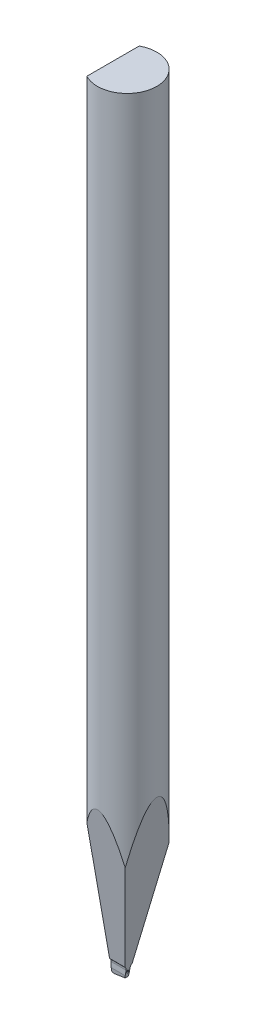
ISO-10303-21;
HEADER;
FILE_DESCRIPTION(('STEP AP214'),'2;1');
FILE_NAME('part.step','',(''),(''),'','','');
FILE_SCHEMA(('AUTOMOTIVE_DESIGN { 1 0 10303 214 1 1 1 1 }'));
ENDSEC;
DATA;
#1=APPLICATION_CONTEXT('core data for automotive mechanical design processes');
#2=APPLICATION_PROTOCOL_DEFINITION('international standard','automotive_design',2000,#1);
#3=PRODUCT_CONTEXT('',#1,'mechanical');
#4=PRODUCT('Part','Part','',(#3));
#5=PRODUCT_RELATED_PRODUCT_CATEGORY('part','',(#4));
#6=PRODUCT_DEFINITION_FORMATION('','',#4);
#7=PRODUCT_DEFINITION_CONTEXT('part definition',#1,'design');
#8=PRODUCT_DEFINITION('design','',#6,#7);
#9=PRODUCT_DEFINITION_SHAPE('','',#8);
#10=(LENGTH_UNIT() NAMED_UNIT(*) SI_UNIT(.MILLI.,.METRE.));
#11=(NAMED_UNIT(*) PLANE_ANGLE_UNIT() SI_UNIT($,.RADIAN.));
#12=(NAMED_UNIT(*) SI_UNIT($,.STERADIAN.) SOLID_ANGLE_UNIT());
#13=UNCERTAINTY_MEASURE_WITH_UNIT(LENGTH_MEASURE(1.E-05),#10,'distance_accuracy_value','');
#14=(GEOMETRIC_REPRESENTATION_CONTEXT(3) GLOBAL_UNCERTAINTY_ASSIGNED_CONTEXT((#13)) GLOBAL_UNIT_ASSIGNED_CONTEXT((#10,
#11,#12)) REPRESENTATION_CONTEXT('',''));
#15=CARTESIAN_POINT('',(0.,0.,0.));
#16=DIRECTION('',(0.,0.,1.));
#17=DIRECTION('',(1.,0.,0.));
#18=AXIS2_PLACEMENT_3D('',#15,#16,#17);
#19=CARTESIAN_POINT('',(26.8738719491216,0.,0.03048));
#20=DIRECTION('',(0.,-0.173648177666931,0.984807753012208));
#21=DIRECTION('',(0.,-0.984807753012208,-0.173648177666931));
#22=AXIS2_PLACEMENT_3D('',#19,#20,#21);
#23=PLANE('',#22);
#24=CARTESIAN_POINT('',(-0.3480816,0.02794,0.0354065758409912));
#25=DIRECTION('',(0.,-0.173648177666931,0.984807753012208));
#26=DIRECTION('',(0.,-0.984807753012208,-0.173648177666931));
#27=AXIS2_PLACEMENT_3D('',#24,#25,#26);
#28=ELLIPSE('',#27,0.0283710195360877,0.02794);
#29=CARTESIAN_POINT('',(-0.348081599999999,0.,0.0305196359577052));
#30=VERTEX_POINT('',#29);
#31=CARTESIAN_POINT('',(-0.37592,0.0255594358987768,0.0349868181606424));
#32=VERTEX_POINT('',#31);
#33=EDGE_CURVE('E256',#30,#32,#28,.F.);
#34=ORIENTED_EDGE('',*,*,#33,.F.);
#35=CARTESIAN_POINT('',(-0.299720000000003,0.,0.0305592719154106));
#36=DIRECTION('',(-1.,0.,0.));
#37=VECTOR('',#36,1.);
#38=LINE('',#35,#37);
#39=CARTESIAN_POINT('',(-0.299720000000004,0.,0.0305196359577053));
#40=VERTEX_POINT('',#39);
#41=EDGE_CURVE('E283',#40,#30,#38,.T.);
#42=ORIENTED_EDGE('',*,*,#41,.F.);
#43=DIRECTION('',(-0.984346441568213,-0.173566836012845,-0.0306045161452665));
#44=VECTOR('',#43,1.);
#45=CARTESIAN_POINT('',(26.0298035813508,4.64260539659195,0.849096592201888));
#46=LINE('',#45,#44);
#47=CARTESIAN_POINT('',(-0.0113543651851163,0.0508466417269895,0.0394456348148853));
#48=VERTEX_POINT('',#47);
#49=EDGE_CURVE('E356',#48,#40,#46,.T.);
#50=ORIENTED_EDGE('',*,*,#49,.F.);
#51=DIRECTION('',(-0.171087869746036,-0.970287525247814,-0.171087869746036));
#52=VECTOR('',#51,1.);
#53=CARTESIAN_POINT('',(0.766901483986011,4.46455489014234,0.817701483986016));
#54=LINE('',#53,#52);
#55=CARTESIAN_POINT('',(0.,0.115240446574631,0.0508));
#56=VERTEX_POINT('',#55);
#57=EDGE_CURVE('E341',#56,#48,#54,.T.);
#58=ORIENTED_EDGE('',*,*,#57,.F.);
#59=DIRECTION('',(-1.,0.,0.));
#60=VECTOR('',#59,1.);
#61=CARTESIAN_POINT('',(26.8738719491216,0.115240446574631,0.0508));
#62=LINE('',#61,#60);
#63=CARTESIAN_POINT('',(-0.375919999999998,0.115240446574631,0.0508));
#64=VERTEX_POINT('',#63);
#65=EDGE_CURVE('E539',#56,#64,#62,.T.);
#66=ORIENTED_EDGE('',*,*,#65,.T.);
#67=DIRECTION('',(0.,0.984807753012208,0.173648177666931));
#68=VECTOR('',#67,1.);
#69=CARTESIAN_POINT('',(-0.37592,20.2545871772642,3.60191020246341));
#70=LINE('',#69,#68);
#71=EDGE_CURVE('E54',#32,#64,#70,.T.);
#72=ORIENTED_EDGE('',*,*,#71,.F.);
#73=EDGE_LOOP('',(#34,#42,#50,#58,#66,#72));
#74=FACE_BOUND('',#73,.T.);
#75=ADVANCED_FACE('F46',(#74),#23,.T.);
#76=CARTESIAN_POINT('',(26.8738719491216,0.,-0.03048));
#77=DIRECTION('',(0.,-0.173648177666931,-0.984807753012208));
#78=DIRECTION('',(0.,0.984807753012208,-0.173648177666931));
#79=AXIS2_PLACEMENT_3D('',#76,#77,#78);
#80=PLANE('',#79);
#81=CARTESIAN_POINT('',(-0.3480816,0.02794,-0.0354065758409912));
#82=DIRECTION('',(0.,-0.173648177666931,-0.984807753012208));
#83=DIRECTION('',(0.,0.984807753012208,-0.173648177666931));
#84=AXIS2_PLACEMENT_3D('',#81,#82,#83);
#85=ELLIPSE('',#84,0.0283710195360877,0.02794);
#86=CARTESIAN_POINT('',(-0.37592,0.0255594358987768,-0.0349868181606433));
#87=VERTEX_POINT('',#86);
#88=CARTESIAN_POINT('',(-0.348081601133757,0.,-0.0305196359577052));
#89=VERTEX_POINT('',#88);
#90=EDGE_CURVE('E216',#87,#89,#85,.F.);
#91=ORIENTED_EDGE('',*,*,#90,.F.);
#92=DIRECTION('',(0.,-0.984807753012208,0.173648177666931));
#93=VECTOR('',#92,1.);
#94=CARTESIAN_POINT('',(-0.37592,20.5290514950398,-3.65030566692899));
#95=LINE('',#94,#93);
#96=CARTESIAN_POINT('',(-0.375919999999998,0.115240446574631,-0.0508));
#97=VERTEX_POINT('',#96);
#98=EDGE_CURVE('E75',#97,#87,#95,.T.);
#99=ORIENTED_EDGE('',*,*,#98,.F.);
#100=DIRECTION('',(1.,0.,0.));
#101=VECTOR('',#100,1.);
#102=CARTESIAN_POINT('',(26.8738719491216,0.115240446574631,-0.0508));
#103=LINE('',#102,#101);
#104=CARTESIAN_POINT('',(0.,0.115240446574631,-0.0508));
#105=VERTEX_POINT('',#104);
#106=EDGE_CURVE('E398',#97,#105,#103,.T.);
#107=ORIENTED_EDGE('',*,*,#106,.T.);
#108=DIRECTION('',(0.171087869746036,0.970287525247814,-0.171087869746036));
#109=VECTOR('',#108,1.);
#110=CARTESIAN_POINT('',(0.766901483986011,4.46455489014234,-0.817701483986016));
#111=LINE('',#110,#109);
#112=CARTESIAN_POINT('',(-0.0113543651851163,0.0508466417269895,-0.0394456348148853));
#113=VERTEX_POINT('',#112);
#114=EDGE_CURVE('E353',#113,#105,#111,.T.);
#115=ORIENTED_EDGE('',*,*,#114,.F.);
#116=DIRECTION('',(0.984346441568213,0.173566836012845,-0.0306045161452665));
#117=VECTOR('',#116,1.);
#118=CARTESIAN_POINT('',(26.0298035813508,4.64260539659195,-0.849096592201888));
#119=LINE('',#118,#117);
#120=CARTESIAN_POINT('',(-0.299720000000004,0.,-0.0305196359577053));
#121=VERTEX_POINT('',#120);
#122=EDGE_CURVE('E439',#121,#113,#119,.T.);
#123=ORIENTED_EDGE('',*,*,#122,.F.);
#124=CARTESIAN_POINT('',(-0.299720000000007,0.,-0.0304799999999999));
#125=DIRECTION('',(-1.,0.,0.));
#126=VECTOR('',#125,1.);
#127=LINE('',#124,#126);
#128=EDGE_CURVE('E278',#121,#89,#127,.T.);
#129=ORIENTED_EDGE('',*,*,#128,.T.);
#130=EDGE_LOOP('',(#91,#99,#107,#115,#123,#129));
#131=FACE_BOUND('',#130,.T.);
#132=ADVANCED_FACE('F422',(#131),#80,.T.);
#133=CARTESIAN_POINT('',(-0.29972,0.,26.5186797019495));
#134=DIRECTION('',(-0.173648177666931,0.984807753012208,0.));
#135=DIRECTION('',(-0.984807753012208,-0.173648177666931,0.));
#136=AXIS2_PLACEMENT_3D('',#133,#134,#135);
#137=PLANE('',#136);
#138=ORIENTED_EDGE('',*,*,#49,.T.);
#139=CARTESIAN_POINT('',(-0.983960151536872,-0.12065,0.));
#140=DIRECTION('',(-0.173648177666931,0.984807753012208,0.));
#141=DIRECTION('',(-0.984807753012208,-0.173648177666931,0.));
#142=AXIS2_PLACEMENT_3D('',#139,#140,#141);
#143=ELLIPSE('',#142,0.716736574332053,0.12446);
#144=CARTESIAN_POINT('',(-0.286429626386801,0.00234345145169803,0.0190499999999998));
#145=VERTEX_POINT('',#144);
#146=EDGE_CURVE('E291',#40,#145,#143,.T.);
#147=ORIENTED_EDGE('',*,*,#146,.T.);
#148=DIRECTION('',(-0.984807753012208,-0.173648177666931,0.));
#149=VECTOR('',#148,1.);
#150=CARTESIAN_POINT('',(-0.29972,0.,0.0190499999999996));
#151=LINE('',#150,#149);
#152=CARTESIAN_POINT('',(-0.1397,0.0282158434529687,0.0190499999999998));
#153=VERTEX_POINT('',#152);
#154=EDGE_CURVE('E465',#153,#145,#151,.T.);
#155=ORIENTED_EDGE('',*,*,#154,.F.);
#156=DIRECTION('',(0.,0.,1.));
#157=VECTOR('',#156,1.);
#158=CARTESIAN_POINT('',(-0.1397,0.0282158434529687,26.5186797019495));
#159=LINE('',#158,#157);
#160=CARTESIAN_POINT('',(-0.1397,0.0282158434529687,-0.0190499999999998));
#161=VERTEX_POINT('',#160);
#162=EDGE_CURVE('E452',#161,#153,#159,.T.);
#163=ORIENTED_EDGE('',*,*,#162,.F.);
#164=DIRECTION('',(-0.984807753012208,-0.173648177666931,0.));
#165=VECTOR('',#164,1.);
#166=CARTESIAN_POINT('',(-0.29972,0.,-0.0190499999999996));
#167=LINE('',#166,#165);
#168=CARTESIAN_POINT('',(-0.286429626386801,0.00234345145169803,-0.0190499999999998));
#169=VERTEX_POINT('',#168);
#170=EDGE_CURVE('E446',#161,#169,#167,.T.);
#171=ORIENTED_EDGE('',*,*,#170,.T.);
#172=EDGE_CURVE('E289',#169,#121,#143,.T.);
#173=ORIENTED_EDGE('',*,*,#172,.T.);
#174=ORIENTED_EDGE('',*,*,#122,.T.);
#175=DIRECTION('',(0.,0.,-1.));
#176=VECTOR('',#175,1.);
#177=CARTESIAN_POINT('',(-0.0113543651851151,0.0508466417269888,26.5186797019495));
#178=LINE('',#177,#176);
#179=EDGE_CURVE('E324',#48,#113,#178,.T.);
#180=ORIENTED_EDGE('',*,*,#179,.F.);
#181=EDGE_LOOP('',(#138,#147,#155,#163,#171,#173,#174,#180));
#182=FACE_BOUND('',#181,.T.);
#183=ADVANCED_FACE('F503',(#182),#137,.F.);
#184=CARTESIAN_POINT('',(0.,21.0312,0.));
#185=DIRECTION('',(0.,-1.,0.));
#186=DIRECTION('',(0.,0.,-1.));
#187=AXIS2_PLACEMENT_3D('',#184,#185,#186);
#188=CYLINDRICAL_SURFACE('',#187,0.792479999999998);
#189=CARTESIAN_POINT('',(0.,-0.172860669861948,0.));
#190=DIRECTION('',(0.,-0.173648177666931,0.984807753012208));
#191=DIRECTION('',(0.,-0.984807753012208,-0.173648177666931));
#192=AXIS2_PLACEMENT_3D('',#189,#190,#191);
#193=ELLIPSE('',#192,4.56371043248163,0.792479999999998);
#194=CARTESIAN_POINT('',(0.534392028524877,3.1459282424964,0.585192028524881));
#195=VERTEX_POINT('',#194);
#196=CARTESIAN_POINT('',(-0.37592,3.78368137728878,0.69764511322018));
#197=VERTEX_POINT('',#196);
#198=EDGE_CURVE('E376',#195,#197,#193,.T.);
#199=ORIENTED_EDGE('',*,*,#198,.F.);
#200=CARTESIAN_POINT('',(0.,0.115240446574631,0.));
#201=DIRECTION('',(-0.984807753012208,0.173648177666931,0.));
#202=DIRECTION('',(-0.173648177666931,-0.984807753012208,0.));
#203=AXIS2_PLACEMENT_3D('',#200,#201,#202);
#204=ELLIPSE('',#203,4.56371043248165,0.792479999999998);
#205=CARTESIAN_POINT('',(0.534392028524877,3.1459282424964,-0.585192028524881));
#206=VERTEX_POINT('',#205);
#207=EDGE_CURVE('E333',#195,#206,#204,.T.);
#208=ORIENTED_EDGE('',*,*,#207,.T.);
#209=CARTESIAN_POINT('',(0.,-0.172860669861948,0.));
#210=DIRECTION('',(0.,-0.173648177666931,-0.984807753012208));
#211=DIRECTION('',(0.,-0.984807753012208,0.173648177666931));
#212=AXIS2_PLACEMENT_3D('',#209,#210,#211);
#213=ELLIPSE('',#212,4.56371043248163,0.792479999999998);
#214=CARTESIAN_POINT('',(-0.37592,3.78368137728877,-0.69764511322018));
#215=VERTEX_POINT('',#214);
#216=EDGE_CURVE('E378',#215,#206,#213,.T.);
#217=ORIENTED_EDGE('',*,*,#216,.F.);
#218=DIRECTION('',(0.,-1.,0.));
#219=VECTOR('',#218,1.);
#220=CARTESIAN_POINT('',(-0.37592,21.0312,-0.69764511322018));
#221=LINE('',#220,#219);
#222=CARTESIAN_POINT('',(-0.37592,21.0312,-0.69764511322018));
#223=VERTEX_POINT('',#222);
#224=EDGE_CURVE('E385',#223,#215,#221,.T.);
#225=ORIENTED_EDGE('',*,*,#224,.F.);
#226=CARTESIAN_POINT('',(0.,21.0312,0.));
#227=DIRECTION('',(0.,1.,0.));
#228=DIRECTION('',(0.,0.,1.));
#229=AXIS2_PLACEMENT_3D('',#226,#227,#228);
#230=CIRCLE('',#229,0.792479999999998);
#231=CARTESIAN_POINT('',(-0.37592,21.0312,0.69764511322018));
#232=VERTEX_POINT('',#231);
#233=EDGE_CURVE('E388',#232,#223,#230,.T.);
#234=ORIENTED_EDGE('',*,*,#233,.F.);
#235=DIRECTION('',(0.,-1.,0.));
#236=VECTOR('',#235,1.);
#237=CARTESIAN_POINT('',(-0.37592,21.0312,0.69764511322018));
#238=LINE('',#237,#236);
#239=EDGE_CURVE('E383',#197,#232,#238,.F.);
#240=ORIENTED_EDGE('',*,*,#239,.F.);
#241=EDGE_LOOP('',(#199,#208,#217,#225,#234,#240));
#242=FACE_BOUND('',#241,.T.);
#243=ADVANCED_FACE('F506',(#242),#188,.T.);
#244=CARTESIAN_POINT('',(-0.37592,21.0312,-0.80247998));
#245=DIRECTION('',(-1.,0.,0.));
#246=DIRECTION('',(0.,0.,1.));
#247=AXIS2_PLACEMENT_3D('',#244,#245,#246);
#248=PLANE('',#247);
#249=CARTESIAN_POINT('',(-0.37592,0.,0.0305592719154106));
#250=CARTESIAN_POINT('',(-0.37592,0.0146958072941779,0.023773050294587));
#251=CARTESIAN_POINT('',(-0.37592,0.0292100000000017,0.0123620164096919));
#252=CARTESIAN_POINT('',(-0.37592,0.0292100000000017,-0.0123620164096919));
#253=CARTESIAN_POINT('',(-0.37592,0.014695807294178,-0.0237730502945872));
#254=CARTESIAN_POINT('',(-0.37592,0.,-0.0305592719154106));
#255=(BOUNDED_CURVE() B_SPLINE_CURVE(3,(#249,#250,#251,#252,#253,#254),.UNSPECIFIED.,.F.,
.F.) B_SPLINE_CURVE_WITH_KNOTS((4,2,4),(1.32272489561682,1.5707963267949,1.81886775797297),
.UNSPECIFIED.) CURVE() GEOMETRIC_REPRESENTATION_ITEM() RATIONAL_B_SPLINE_CURVE((1.,1.,1.,1.,1.,1.)) REPRESENTATION_ITEM(''));
#256=CARTESIAN_POINT('',(-0.37592000000032,0.025559394396128,-0.0110393991774753));
#257=VERTEX_POINT('',#256);
#258=CARTESIAN_POINT('',(-0.37592,0.025559351068185,0.0109420294245943));
#259=VERTEX_POINT('',#258);
#260=EDGE_CURVE('E202',#257,#259,#255,.F.);
#261=ORIENTED_EDGE('',*,*,#260,.T.);
#262=DIRECTION('',(0.,0.,-1.));
#263=VECTOR('',#262,1.);
#264=CARTESIAN_POINT('',(-0.37592,0.0255594358987817,26.4346140091545));
#265=LINE('',#264,#263);
#266=EDGE_CURVE('E68',#32,#259,#265,.T.);
#267=ORIENTED_EDGE('',*,*,#266,.F.);
#268=ORIENTED_EDGE('',*,*,#71,.T.);
#269=DIRECTION('',(0.,1.,0.));
#270=VECTOR('',#269,1.);
#271=CARTESIAN_POINT('',(-0.37592,21.0312,0.0508));
#272=LINE('',#271,#270);
#273=CARTESIAN_POINT('',(-0.375919999999998,0.254,0.0508));
#274=VERTEX_POINT('',#273);
#275=EDGE_CURVE('E373',#64,#274,#272,.T.);
#276=ORIENTED_EDGE('',*,*,#275,.T.);
#277=CARTESIAN_POINT('',(-0.375919999999998,0.254,0.1778));
#278=DIRECTION('',(-1.,0.,0.));
#279=DIRECTION('',(0.,0.,1.));
#280=AXIS2_PLACEMENT_3D('',#277,#278,#279);
#281=CIRCLE('',#280,0.127);
#282=CARTESIAN_POINT('',(-0.375919999999998,0.343802561210692,0.0879974387893087));
#283=VERTEX_POINT('',#282);
#284=EDGE_CURVE('E459',#274,#283,#281,.F.);
#285=ORIENTED_EDGE('',*,*,#284,.T.);
#286=DIRECTION('',(0.,0.707106781186546,0.707106781186549));
#287=VECTOR('',#286,1.);
#288=CARTESIAN_POINT('',(-0.37592,10.2422625712106,9.98645744878931));
#289=LINE('',#288,#287);
#290=CARTESIAN_POINT('',(-0.375919999999998,0.347571324683702,0.0917662022623191));
#291=VERTEX_POINT('',#290);
#292=EDGE_CURVE('E370',#283,#291,#289,.T.);
#293=ORIENTED_EDGE('',*,*,#292,.T.);
#294=EDGE_CURVE('E390',#291,#197,#70,.T.);
#295=ORIENTED_EDGE('',*,*,#294,.T.);
#296=ORIENTED_EDGE('',*,*,#239,.T.);
#297=DIRECTION('',(0.,0.,-1.));
#298=VECTOR('',#297,1.);
#299=CARTESIAN_POINT('',(-0.37592,21.0312,-0.80247998));
#300=LINE('',#299,#298);
#301=EDGE_CURVE('E381',#232,#223,#300,.T.);
#302=ORIENTED_EDGE('',*,*,#301,.T.);
#303=ORIENTED_EDGE('',*,*,#224,.T.);
#304=CARTESIAN_POINT('',(-0.375919999999998,0.347571324683702,-0.0917662022623191));
#305=VERTEX_POINT('',#304);
#306=EDGE_CURVE('E394',#215,#305,#95,.T.);
#307=ORIENTED_EDGE('',*,*,#306,.T.);
#308=DIRECTION('',(0.,-0.707106781186546,0.707106781186549));
#309=VECTOR('',#308,1.);
#310=CARTESIAN_POINT('',(-0.37592,11.0447425512106,-10.7889374287893));
#311=LINE('',#310,#309);
#312=CARTESIAN_POINT('',(-0.375919999999998,0.343802561210692,-0.0879974387893087));
#313=VERTEX_POINT('',#312);
#314=EDGE_CURVE('E367',#305,#313,#311,.T.);
#315=ORIENTED_EDGE('',*,*,#314,.T.);
#316=CARTESIAN_POINT('',(-0.375919999999998,0.254,-0.1778));
#317=DIRECTION('',(-1.,0.,0.));
#318=DIRECTION('',(0.,0.,1.));
#319=AXIS2_PLACEMENT_3D('',#316,#317,#318);
#320=CIRCLE('',#319,0.127);
#321=CARTESIAN_POINT('',(-0.375919999999998,0.254,-0.0508));
#322=VERTEX_POINT('',#321);
#323=EDGE_CURVE('E455',#313,#322,#320,.F.);
#324=ORIENTED_EDGE('',*,*,#323,.T.);
#325=DIRECTION('',(0.,-1.,0.));
#326=VECTOR('',#325,1.);
#327=CARTESIAN_POINT('',(-0.37592,21.0312,-0.0508));
#328=LINE('',#327,#326);
#329=EDGE_CURVE('E365',#322,#97,#328,.T.);
#330=ORIENTED_EDGE('',*,*,#329,.T.);
#331=ORIENTED_EDGE('',*,*,#98,.T.);
#332=EDGE_CURVE('E211',#257,#87,#265,.T.);
#333=ORIENTED_EDGE('',*,*,#332,.F.);
#334=EDGE_LOOP('',(#261,#267,#268,#276,#285,#293,#295,#296,#302,#303,#307,#315,#324,#330,#331,#333));
#335=FACE_BOUND('',#334,.T.);
#336=ADVANCED_FACE('F212',(#335),#248,.T.);
#337=DIRECTION('',(-0.171087869746036,-0.970287525247814,-0.171087869746036));
#338=VECTOR('',#337,1.);
#339=CARTESIAN_POINT('',(0.766901483986011,4.46455489014234,0.817701483986016));
#340=LINE('',#339,#338);
#341=CARTESIAN_POINT('',(0.0409662022623215,0.347571324683702,0.091766202262319));
#342=VERTEX_POINT('',#341);
#343=EDGE_CURVE('E330',#195,#342,#340,.T.);
#344=ORIENTED_EDGE('',*,*,#343,.F.);
#345=ORIENTED_EDGE('',*,*,#198,.T.);
#346=ORIENTED_EDGE('',*,*,#294,.F.);
#347=DIRECTION('',(1.,0.,0.));
#348=VECTOR('',#347,1.);
#349=CARTESIAN_POINT('',(26.8738719491216,0.347571324683702,0.0917662022623191));
#350=LINE('',#349,#348);
#351=EDGE_CURVE('E535',#291,#342,#350,.T.);
#352=ORIENTED_EDGE('',*,*,#351,.T.);
#353=EDGE_LOOP('',(#344,#345,#346,#352));
#354=FACE_BOUND('',#353,.T.);
#355=ADVANCED_FACE('F423',(#354),#23,.T.);
#356=DIRECTION('',(0.171087869746036,0.970287525247814,-0.171087869746036));
#357=VECTOR('',#356,1.);
#358=CARTESIAN_POINT('',(0.766901483986011,4.46455489014234,-0.817701483986016));
#359=LINE('',#358,#357);
#360=CARTESIAN_POINT('',(0.0409662022623215,0.347571324683702,-0.091766202262319));
#361=VERTEX_POINT('',#360);
#362=EDGE_CURVE('E338',#361,#206,#359,.T.);
#363=ORIENTED_EDGE('',*,*,#362,.F.);
#364=DIRECTION('',(-1.,0.,0.));
#365=VECTOR('',#364,1.);
#366=CARTESIAN_POINT('',(26.8738719491216,0.347571324683702,-0.0917662022623191));
#367=LINE('',#366,#365);
#368=EDGE_CURVE('E534',#361,#305,#367,.T.);
#369=ORIENTED_EDGE('',*,*,#368,.T.);
#370=ORIENTED_EDGE('',*,*,#306,.F.);
#371=ORIENTED_EDGE('',*,*,#216,.T.);
#372=EDGE_LOOP('',(#363,#369,#370,#371));
#373=FACE_BOUND('',#372,.T.);
#374=ADVANCED_FACE('F426',(#373),#80,.T.);
#375=CARTESIAN_POINT('',(0.,21.0312,0.));
#376=DIRECTION('',(0.,1.,0.));
#377=DIRECTION('',(0.,0.,1.));
#378=AXIS2_PLACEMENT_3D('',#375,#376,#377);
#379=PLANE('',#378);
#380=ORIENTED_EDGE('',*,*,#233,.T.);
#381=ORIENTED_EDGE('',*,*,#301,.F.);
#382=EDGE_LOOP('',(#380,#381));
#383=FACE_BOUND('',#382,.T.);
#384=ADVANCED_FACE('F430',(#383),#379,.T.);
#385=CARTESIAN_POINT('',(26.8738719491216,0.,-0.0508));
#386=DIRECTION('',(0.,0.,-1.));
#387=DIRECTION('',(-1.,0.,0.));
#388=AXIS2_PLACEMENT_3D('',#385,#386,#387);
#389=PLANE('',#388);
#390=DIRECTION('',(0.173648177666931,0.984807753012208,0.));
#391=VECTOR('',#390,1.);
#392=CARTESIAN_POINT('',(0.790639116266124,4.59917769253331,-0.0508));
#393=LINE('',#392,#391);
#394=CARTESIAN_POINT('',(0.0244670530999483,0.254,-0.0508));
#395=VERTEX_POINT('',#394);
#396=EDGE_CURVE('E350',#105,#395,#393,.T.);
#397=ORIENTED_EDGE('',*,*,#396,.F.);
#398=ORIENTED_EDGE('',*,*,#106,.F.);
#399=ORIENTED_EDGE('',*,*,#329,.F.);
#400=DIRECTION('',(-1.,0.,0.));
#401=VECTOR('',#400,1.);
#402=CARTESIAN_POINT('',(26.8738719491216,0.254,-0.0508));
#403=LINE('',#402,#401);
#404=EDGE_CURVE('E361',#395,#322,#403,.T.);
#405=ORIENTED_EDGE('',*,*,#404,.F.);
#406=EDGE_LOOP('',(#397,#398,#399,#405));
#407=FACE_BOUND('',#406,.T.);
#408=ADVANCED_FACE('F519',(#407),#389,.T.);
#409=CARTESIAN_POINT('',(26.8738719491216,0.343802561210692,-0.0879974387893087));
#410=DIRECTION('',(0.,-0.707106781186549,-0.707106781186546));
#411=DIRECTION('',(0.,0.707106781186546,-0.707106781186549));
#412=AXIS2_PLACEMENT_3D('',#409,#410,#411);
#413=PLANE('',#412);
#414=DIRECTION('',(0.123724030206484,0.701673843159862,-0.701673843159865));
#415=VECTOR('',#414,1.);
#416=CARTESIAN_POINT('',(0.451060184651006,2.67332987133929,-2.41752474891792));
#417=LINE('',#416,#415);
#418=CARTESIAN_POINT('',(0.0403016675781138,0.343802561210692,-0.0879974387893087));
#419=VERTEX_POINT('',#418);
#420=EDGE_CURVE('E344',#419,#361,#417,.T.);
#421=ORIENTED_EDGE('',*,*,#420,.F.);
#422=DIRECTION('',(-1.,0.,0.));
#423=VECTOR('',#422,1.);
#424=CARTESIAN_POINT('',(26.8738719491216,0.343802561210692,-0.0879974387893087));
#425=LINE('',#424,#423);
#426=EDGE_CURVE('E363',#419,#313,#425,.T.);
#427=ORIENTED_EDGE('',*,*,#426,.T.);
#428=ORIENTED_EDGE('',*,*,#314,.F.);
#429=ORIENTED_EDGE('',*,*,#368,.F.);
#430=EDGE_LOOP('',(#421,#427,#428,#429));
#431=FACE_BOUND('',#430,.T.);
#432=ADVANCED_FACE('F424',(#431),#413,.T.);
#433=CARTESIAN_POINT('',(26.8738719491216,0.254,-0.1778));
#434=DIRECTION('',(-1.,0.,0.));
#435=DIRECTION('',(0.,0.,1.));
#436=AXIS2_PLACEMENT_3D('',#433,#434,#435);
#437=CYLINDRICAL_SURFACE('',#436,0.127);
#438=CARTESIAN_POINT('',(0.0244670530999483,0.254,-0.1778));
#439=DIRECTION('',(-0.984807753012208,0.173648177666931,0.));
#440=DIRECTION('',(-0.173648177666931,-0.984807753012208,0.));
#441=AXIS2_PLACEMENT_3D('',#438,#439,#440);
#442=ELLIPSE('',#441,0.12895917970949,0.127);
#443=EDGE_CURVE('E347',#395,#419,#442,.T.);
#444=ORIENTED_EDGE('',*,*,#443,.F.);
#445=ORIENTED_EDGE('',*,*,#404,.T.);
#446=ORIENTED_EDGE('',*,*,#323,.F.);
#447=ORIENTED_EDGE('',*,*,#426,.F.);
#448=EDGE_LOOP('',(#444,#445,#446,#447));
#449=FACE_BOUND('',#448,.T.);
#450=ADVANCED_FACE('F514',(#449),#437,.F.);
#451=CARTESIAN_POINT('',(26.8738719491216,0.254,0.1778));
#452=DIRECTION('',(-1.,0.,0.));
#453=DIRECTION('',(0.,0.,1.));
#454=AXIS2_PLACEMENT_3D('',#451,#452,#453);
#455=CYLINDRICAL_SURFACE('',#454,0.127);
#456=CARTESIAN_POINT('',(0.0244670530999483,0.254,0.1778));
#457=DIRECTION('',(-0.984807753012208,0.173648177666931,0.));
#458=DIRECTION('',(-0.173648177666931,-0.984807753012208,0.));
#459=AXIS2_PLACEMENT_3D('',#456,#457,#458);
#460=ELLIPSE('',#459,0.12895917970949,0.127);
#461=CARTESIAN_POINT('',(0.040301667578118,0.343802561210692,0.087997438789309));
#462=VERTEX_POINT('',#461);
#463=CARTESIAN_POINT('',(0.0244670530999523,0.254,0.0508));
#464=VERTEX_POINT('',#463);
#465=EDGE_CURVE('E327',#462,#464,#460,.T.);
#466=ORIENTED_EDGE('',*,*,#465,.F.);
#467=DIRECTION('',(-1.,0.,0.));
#468=VECTOR('',#467,1.);
#469=CARTESIAN_POINT('',(26.8738719491216,0.343802561210692,0.0879974387893087));
#470=LINE('',#469,#468);
#471=EDGE_CURVE('E357',#462,#283,#470,.T.);
#472=ORIENTED_EDGE('',*,*,#471,.T.);
#473=ORIENTED_EDGE('',*,*,#284,.F.);
#474=DIRECTION('',(-1.,0.,0.));
#475=VECTOR('',#474,1.);
#476=CARTESIAN_POINT('',(26.8738719491216,0.254,0.0508));
#477=LINE('',#476,#475);
#478=EDGE_CURVE('E359',#464,#274,#477,.T.);
#479=ORIENTED_EDGE('',*,*,#478,.F.);
#480=EDGE_LOOP('',(#466,#472,#473,#479));
#481=FACE_BOUND('',#480,.T.);
#482=ADVANCED_FACE('F511',(#481),#455,.F.);
#483=CARTESIAN_POINT('',(26.8738719491216,0.,0.0508));
#484=DIRECTION('',(0.,0.,1.));
#485=DIRECTION('',(1.,0.,0.));
#486=AXIS2_PLACEMENT_3D('',#483,#484,#485);
#487=PLANE('',#486);
#488=DIRECTION('',(-0.173648177666931,-0.984807753012208,0.));
#489=VECTOR('',#488,1.);
#490=CARTESIAN_POINT('',(0.790639116266124,4.59917769253331,0.0508));
#491=LINE('',#490,#489);
#492=EDGE_CURVE('E335',#464,#56,#491,.T.);
#493=ORIENTED_EDGE('',*,*,#492,.F.);
#494=ORIENTED_EDGE('',*,*,#478,.T.);
#495=ORIENTED_EDGE('',*,*,#275,.F.);
#496=ORIENTED_EDGE('',*,*,#65,.F.);
#497=EDGE_LOOP('',(#493,#494,#495,#496));
#498=FACE_BOUND('',#497,.T.);
#499=ADVANCED_FACE('F509',(#498),#487,.T.);
#500=CARTESIAN_POINT('',(26.8738719491216,0.343802561210692,0.0879974387893087));
#501=DIRECTION('',(0.,-0.707106781186549,0.707106781186546));
#502=DIRECTION('',(0.,-0.707106781186546,-0.707106781186549));
#503=AXIS2_PLACEMENT_3D('',#500,#501,#502);
#504=PLANE('',#503);
#505=DIRECTION('',(-0.123724030206484,-0.701673843159862,-0.701673843159865));
#506=VECTOR('',#505,1.);
#507=CARTESIAN_POINT('',(0.451060184651006,2.67332987133929,2.41752474891792));
#508=LINE('',#507,#506);
#509=EDGE_CURVE('E447',#342,#462,#508,.T.);
#510=ORIENTED_EDGE('',*,*,#509,.F.);
#511=ORIENTED_EDGE('',*,*,#351,.F.);
#512=ORIENTED_EDGE('',*,*,#292,.F.);
#513=ORIENTED_EDGE('',*,*,#471,.F.);
#514=EDGE_LOOP('',(#510,#511,#512,#513));
#515=FACE_BOUND('',#514,.T.);
#516=ADVANCED_FACE('F501',(#515),#504,.T.);
#517=CARTESIAN_POINT('',(-0.0113543651851151,0.0508466417269888,26.5186797019495));
#518=DIRECTION('',(-0.984807753012208,0.173648177666931,0.));
#519=DIRECTION('',(-0.173648177666931,-0.984807753012208,0.));
#520=AXIS2_PLACEMENT_3D('',#517,#518,#519);
#521=PLANE('',#520);
#522=CARTESIAN_POINT('',(0.0134757082635934,0.191664985856421,0.));
#523=DIRECTION('',(-0.984807753012208,0.173648177666931,0.));
#524=DIRECTION('',(0.173648177666931,0.984807753012208,0.));
#525=AXIS2_PLACEMENT_3D('',#522,#523,#524);
#526=ELLIPSE('',#525,0.0383454577049638,0.0275429929403328);
#527=CARTESIAN_POINT('',(0.0201343271158647,0.229427889897071,0.));
#528=VERTEX_POINT('',#527);
#529=EDGE_CURVE('E323',#528,#528,#526,.F.);
#530=ORIENTED_EDGE('',*,*,#529,.F.);
#531=EDGE_LOOP('',(#530));
#532=FACE_BOUND('',#531,.T.);
#533=ORIENTED_EDGE('',*,*,#179,.T.);
#534=ORIENTED_EDGE('',*,*,#114,.T.);
#535=ORIENTED_EDGE('',*,*,#396,.T.);
#536=ORIENTED_EDGE('',*,*,#443,.T.);
#537=ORIENTED_EDGE('',*,*,#420,.T.);
#538=ORIENTED_EDGE('',*,*,#362,.T.);
#539=ORIENTED_EDGE('',*,*,#207,.F.);
#540=ORIENTED_EDGE('',*,*,#343,.T.);
#541=ORIENTED_EDGE('',*,*,#509,.T.);
#542=ORIENTED_EDGE('',*,*,#465,.T.);
#543=ORIENTED_EDGE('',*,*,#492,.T.);
#544=ORIENTED_EDGE('',*,*,#57,.T.);
#545=EDGE_LOOP('',(#533,#534,#535,#536,#537,#538,#539,#540,#541,#542,#543,#544));
#546=FACE_BOUND('',#545,.T.);
#547=ADVANCED_FACE('F497',(#532,#546),#521,.F.);
#548=CARTESIAN_POINT('',(-0.1397,0.09144,0.01905));
#549=DIRECTION('',(-1.,0.,0.));
#550=DIRECTION('',(0.,-1.,0.));
#551=AXIS2_PLACEMENT_3D('',#548,#549,#550);
#552=PLANE('',#551);
#553=ORIENTED_EDGE('',*,*,#162,.T.);
#554=DIRECTION('',(0.,1.,0.));
#555=VECTOR('',#554,1.);
#556=CARTESIAN_POINT('',(-0.1397,0.09144,0.01905));
#557=LINE('',#556,#555);
#558=CARTESIAN_POINT('',(-0.1397,0.09144,0.01905));
#559=VERTEX_POINT('',#558);
#560=EDGE_CURVE('E310',#153,#559,#557,.T.);
#561=ORIENTED_EDGE('',*,*,#560,.T.);
#562=CARTESIAN_POINT('',(-0.1397,0.09144,0.));
#563=DIRECTION('',(1.,0.,0.));
#564=DIRECTION('',(0.,1.,0.));
#565=AXIS2_PLACEMENT_3D('',#562,#563,#564);
#566=ELLIPSE('',#565,0.0219970452561247,0.01905);
#567=CARTESIAN_POINT('',(-0.1397,0.09144,-0.0190499999999996));
#568=VERTEX_POINT('',#567);
#569=EDGE_CURVE('E303',#568,#559,#566,.F.);
#570=ORIENTED_EDGE('',*,*,#569,.F.);
#571=DIRECTION('',(0.,1.,0.));
#572=VECTOR('',#571,1.);
#573=CARTESIAN_POINT('',(-0.1397,0.09144,-0.01905));
#574=LINE('',#573,#572);
#575=EDGE_CURVE('E311',#161,#568,#574,.T.);
#576=ORIENTED_EDGE('',*,*,#575,.F.);
#577=EDGE_LOOP('',(#553,#561,#570,#576));
#578=FACE_BOUND('',#577,.T.);
#579=ADVANCED_FACE('F500',(#578),#552,.T.);
#580=CARTESIAN_POINT('',(0.,0.,0.01905));
#581=DIRECTION('',(0.,0.,-1.));
#582=DIRECTION('',(-1.,0.,0.));
#583=AXIS2_PLACEMENT_3D('',#580,#581,#582);
#584=PLANE('',#583);
#585=DIRECTION('',(-1.,0.,0.));
#586=VECTOR('',#585,1.);
#587=CARTESIAN_POINT('',(26.7786219491216,0.00234345145169317,0.01905));
#588=LINE('',#587,#586);
#589=CARTESIAN_POINT('',(-0.301769962417407,0.00234345145169314,0.01905));
#590=VERTEX_POINT('',#589);
#591=EDGE_CURVE('E287',#590,#145,#588,.F.);
#592=ORIENTED_EDGE('',*,*,#591,.F.);
#593=DIRECTION('',(-0.500000000000004,-0.866025403784436,0.));
#594=VECTOR('',#593,1.);
#595=CARTESIAN_POINT('',(-0.227342216057905,0.131256089639199,0.01905));
#596=LINE('',#595,#594);
#597=CARTESIAN_POINT('',(-0.250330046129175,0.09144,0.01905));
#598=VERTEX_POINT('',#597);
#599=EDGE_CURVE('E313',#598,#590,#596,.T.);
#600=ORIENTED_EDGE('',*,*,#599,.F.);
#601=DIRECTION('',(-1.,0.,0.));
#602=VECTOR('',#601,1.);
#603=CARTESIAN_POINT('',(-0.2723270913853,0.09144,0.01905));
#604=LINE('',#603,#602);
#605=EDGE_CURVE('E307',#559,#598,#604,.T.);
#606=ORIENTED_EDGE('',*,*,#605,.F.);
#607=ORIENTED_EDGE('',*,*,#560,.F.);
#608=ORIENTED_EDGE('',*,*,#154,.T.);
#609=EDGE_LOOP('',(#592,#600,#606,#607,#608));
#610=FACE_BOUND('',#609,.T.);
#611=ADVANCED_FACE('F650',(#610),#584,.T.);
#612=CARTESIAN_POINT('',(0.,0.,-0.01905));
#613=DIRECTION('',(0.,0.,-1.));
#614=DIRECTION('',(-1.,0.,0.));
#615=AXIS2_PLACEMENT_3D('',#612,#613,#614);
#616=PLANE('',#615);
#617=DIRECTION('',(0.500000000000004,0.866025403784436,0.));
#618=VECTOR('',#617,1.);
#619=CARTESIAN_POINT('',(-0.250330046129175,0.09144,-0.01905));
#620=LINE('',#619,#618);
#621=CARTESIAN_POINT('',(-0.301769962417407,0.00234345145169317,-0.01905));
#622=VERTEX_POINT('',#621);
#623=CARTESIAN_POINT('',(-0.250330046129175,0.09144,-0.01905));
#624=VERTEX_POINT('',#623);
#625=EDGE_CURVE('E319',#622,#624,#620,.T.);
#626=ORIENTED_EDGE('',*,*,#625,.F.);
#627=DIRECTION('',(-1.,0.,0.));
#628=VECTOR('',#627,1.);
#629=CARTESIAN_POINT('',(26.7786219491216,0.00234345145169317,-0.01905));
#630=LINE('',#629,#628);
#631=EDGE_CURVE('E263',#622,#169,#630,.F.);
#632=ORIENTED_EDGE('',*,*,#631,.T.);
#633=ORIENTED_EDGE('',*,*,#170,.F.);
#634=ORIENTED_EDGE('',*,*,#575,.T.);
#635=DIRECTION('',(-1.,0.,0.));
#636=VECTOR('',#635,1.);
#637=CARTESIAN_POINT('',(-0.2723270913853,0.09144,-0.01905));
#638=LINE('',#637,#636);
#639=EDGE_CURVE('E306',#568,#624,#638,.T.);
#640=ORIENTED_EDGE('',*,*,#639,.T.);
#641=EDGE_LOOP('',(#626,#632,#633,#634,#640));
#642=FACE_BOUND('',#641,.T.);
#643=ADVANCED_FACE('F661',(#642),#616,.F.);
#644=CARTESIAN_POINT('',(-0.00300531826952352,0.17036071129388,0.));
#645=DIRECTION('',(0.866025403784441,0.499999999999995,0.));
#646=DIRECTION('',(-0.499999999999995,0.866025403784441,0.));
#647=AXIS2_PLACEMENT_3D('',#644,#645,#646);
#648=CONICAL_SURFACE('',#647,0.01905,0.392699081698725);
#649=CARTESIAN_POINT('',(-0.00300531826952352,0.17036071129388,0.));
#650=DIRECTION('',(0.866025403784441,0.499999999999995,0.));
#651=DIRECTION('',(-0.499999999999995,0.866025403784441,0.));
#652=AXIS2_PLACEMENT_3D('',#649,#650,#651);
#653=CIRCLE('',#652,0.01905);
#654=CARTESIAN_POINT('',(-0.0125303182695234,0.186858495235974,0.));
#655=VERTEX_POINT('',#654);
#656=EDGE_CURVE('E297',#655,#655,#653,.T.);
#657=ORIENTED_EDGE('',*,*,#656,.F.);
#658=EDGE_LOOP('',(#657));
#659=FACE_BOUND('',#658,.T.);
#660=ORIENTED_EDGE('',*,*,#529,.T.);
#661=EDGE_LOOP('',(#660));
#662=FACE_BOUND('',#661,.T.);
#663=ADVANCED_FACE('F495',(#659,#662),#648,.F.);
#664=CARTESIAN_POINT('',(-0.250330046129175,0.09144,0.));
#665=DIRECTION('',(-0.500000000000004,-0.866025403784436,0.));
#666=DIRECTION('',(0.866025403784436,-0.500000000000004,0.));
#667=AXIS2_PLACEMENT_3D('',#664,#665,#666);
#668=CYLINDRICAL_SURFACE('',#667,0.01905);
#669=ORIENTED_EDGE('',*,*,#599,.T.);
#670=CARTESIAN_POINT('',(-0.301769962417407,0.00234345145169314,0.01905));
#671=CARTESIAN_POINT('',(-0.303083212357795,0.00234273884135903,0.0190505532683335));
#672=CARTESIAN_POINT('',(-0.304398530056794,0.00235919648592935,0.0189481276282325));
#673=CARTESIAN_POINT('',(-0.307000954094572,0.00242318594032791,0.0185302442706134));
#674=CARTESIAN_POINT('',(-0.308287873692993,0.00247088218091991,0.0182136589885027));
#675=CARTESIAN_POINT('',(-0.310790852582439,0.00259423811870583,0.0173587153989119));
#676=CARTESIAN_POINT('',(-0.312006641691863,0.00266999731654825,0.0168195671794881));
#677=CARTESIAN_POINT('',(-0.314311894657055,0.00283986679158173,0.015523243690556));
#678=CARTESIAN_POINT('',(-0.315401659849181,0.00293393178806268,0.0147666042420507));
#679=CARTESIAN_POINT('',(-0.31730332104955,0.00311685645192294,0.0131397171256992));
#680=CARTESIAN_POINT('',(-0.318132319467869,0.00320524260215012,0.0122894206437063));
#681=CARTESIAN_POINT('',(-0.3196165652278,0.00337418177810725,0.0104472759959153));
#682=CARTESIAN_POINT('',(-0.320271844381019,0.00345473623626944,0.00945545379765719));
#683=CARTESIAN_POINT('',(-0.3213234426909,0.00358935319513246,0.00746762605607109));
#684=CARTESIAN_POINT('',(-0.32173909228563,0.00364525831027112,0.00648193686690554));
#685=CARTESIAN_POINT('',(-0.322389726393463,0.00373449435681656,0.0044518189481206));
#686=CARTESIAN_POINT('',(-0.322624798676981,0.00376783625423748,0.00340741902037943));
#687=CARTESIAN_POINT('',(-0.322897837996913,0.00380671319708877,0.00134948273672548));
#688=CARTESIAN_POINT('',(-0.322945634936013,0.00381363450040313,0.000337264641997512));
#689=CARTESIAN_POINT('',(-0.322869697716228,0.00380274111245844,-0.00168052629893266));
#690=CARTESIAN_POINT('',(-0.322745983850237,0.00378492934757725,-0.00268609991715538));
#691=CARTESIAN_POINT('',(-0.322334355344498,0.00372702254235129,-0.0046473278957709));
#692=CARTESIAN_POINT('',(-0.322048793640665,0.00368724701865936,-0.00560348787902325));
#693=CARTESIAN_POINT('',(-0.321324937242233,0.00358998817113897,-0.00745501684823445));
#694=CARTESIAN_POINT('',(-0.320886639683836,0.00353250451528526,-0.00835038469396416));
#695=CARTESIAN_POINT('',(-0.319862680839835,0.00340476764403495,-0.0100730618825254));
#696=CARTESIAN_POINT('',(-0.319274533821476,0.00333430521919907,-0.0108988749361181));
#697=CARTESIAN_POINT('',(-0.317974173980919,0.00318863460274331,-0.0124454369952645));
#698=CARTESIAN_POINT('',(-0.317261944798882,0.00311342578616174,-0.0131661721235828));
#699=CARTESIAN_POINT('',(-0.31569583062112,0.00296171888527247,-0.0145232749481605));
#700=CARTESIAN_POINT('',(-0.314836555870207,0.00288535232362802,-0.0151534243532859));
#701=CARTESIAN_POINT('',(-0.313030647680624,0.00274271134593144,-0.0162742350252514));
#702=CARTESIAN_POINT('',(-0.312083969657596,0.00267644212671652,-0.0167648245761543));
#703=CARTESIAN_POINT('',(-0.31004264333725,0.00255444746912226,-0.0176399463518506));
#704=CARTESIAN_POINT('',(-0.308942302803632,0.00250016076595805,-0.0180113663892418));
#705=CARTESIAN_POINT('',(-0.306698785837096,0.00241476087320615,-0.0185861575843008));
#706=CARTESIAN_POINT('',(-0.305555627526932,0.00238363799331208,-0.0187895990176943));
#707=CARTESIAN_POINT('',(-0.30352895790095,0.00235048998193052,-0.0190043678177182));
#708=CARTESIAN_POINT('',(-0.302649080375743,0.00234326902739348,-0.0190501179681685));
#709=CARTESIAN_POINT('',(-0.301769962417412,0.00234345145168755,-0.0190500000000401));
#710=B_SPLINE_CURVE_WITH_KNOTS('',3,(#670,#671,#672,#673,#674,#675,#676,#677,#678,#679,#680,
#681,#682,#683,#684,#685,#686,#687,#688,#689,#690,#691,#692,#693,#694,#695,#696,#697,#698,#699,
#700,#701,#702,#703,#704,#705,#706,#707,#708,#709),.UNSPECIFIED.,.F.,.F.,(4,2,2,2,2,2,2,2,2,2,2,
2,2,2,2,2,2,2,2,4),(0.,0.0039388640861778,0.00789862964445358,0.0118725715602336,
0.0158368057995756,0.0193894604666261,0.0229414641187126,0.0261386218593387,0.0293342246220546,
0.0323596502009959,0.0353847178468262,0.0383668955619843,0.0413491291960031,0.0443844811882459,
0.0474202336852696,0.0506115954385173,0.0538045941937902,0.0572782451267952,0.0607504420817328,
0.063388074501748),.UNSPECIFIED.);
#711=EDGE_CURVE('E467',#590,#622,#710,.T.);
#712=ORIENTED_EDGE('',*,*,#711,.T.);
#713=ORIENTED_EDGE('',*,*,#625,.T.);
#714=CARTESIAN_POINT('',(-0.250330046129175,0.09144,0.));
#715=DIRECTION('',(0.,-1.,0.));
#716=DIRECTION('',(-1.,0.,0.));
#717=AXIS2_PLACEMENT_3D('',#714,#715,#716);
#718=ELLIPSE('',#717,0.0219970452561248,0.01905);
#719=EDGE_CURVE('E321',#624,#598,#718,.F.);
#720=ORIENTED_EDGE('',*,*,#719,.T.);
#721=EDGE_LOOP('',(#669,#712,#713,#720));
#722=FACE_BOUND('',#721,.T.);
#723=ADVANCED_FACE('F487',(#722),#668,.F.);
#724=CARTESIAN_POINT('',(-0.2723270913853,0.09144,0.01905));
#725=DIRECTION('',(0.,-1.,0.));
#726=DIRECTION('',(0.,0.,-1.));
#727=AXIS2_PLACEMENT_3D('',#724,#725,#726);
#728=PLANE('',#727);
#729=ORIENTED_EDGE('',*,*,#639,.F.);
#730=CARTESIAN_POINT('',(-0.1397,0.09144,0.));
#731=DIRECTION('',(0.,1.,0.));
#732=DIRECTION('',(1.,0.,0.));
#733=AXIS2_PLACEMENT_3D('',#730,#731,#732);
#734=ELLIPSE('',#733,0.0381000000000004,0.01905);
#735=EDGE_CURVE('E300',#559,#568,#734,.F.);
#736=ORIENTED_EDGE('',*,*,#735,.F.);
#737=ORIENTED_EDGE('',*,*,#605,.T.);
#738=ORIENTED_EDGE('',*,*,#719,.F.);
#739=EDGE_LOOP('',(#729,#736,#737,#738));
#740=FACE_BOUND('',#739,.T.);
#741=ADVANCED_FACE('F494',(#740),#728,.T.);
#742=CARTESIAN_POINT('',(-0.36807289524413,-0.0404111525448111,0.));
#743=DIRECTION('',(0.866025403784441,0.499999999999995,0.));
#744=DIRECTION('',(-0.499999999999995,0.866025403784441,0.));
#745=AXIS2_PLACEMENT_3D('',#742,#743,#744);
#746=CYLINDRICAL_SURFACE('',#745,0.01905);
#747=ORIENTED_EDGE('',*,*,#569,.T.);
#748=ORIENTED_EDGE('',*,*,#735,.T.);
#749=EDGE_LOOP('',(#747,#748));
#750=FACE_BOUND('',#749,.T.);
#751=ORIENTED_EDGE('',*,*,#656,.T.);
#752=EDGE_LOOP('',(#751));
#753=FACE_BOUND('',#752,.T.);
#754=ADVANCED_FACE('F701',(#750,#753),#746,.F.);
#755=CARTESIAN_POINT('',(26.7786219491216,-0.12065,0.));
#756=DIRECTION('',(-1.,0.,0.));
#757=DIRECTION('',(0.,0.,1.));
#758=AXIS2_PLACEMENT_3D('',#755,#756,#757);
#759=CYLINDRICAL_SURFACE('',#758,0.12446);
#760=ORIENTED_EDGE('',*,*,#41,.T.);
#761=CARTESIAN_POINT('',(-0.3480816,0.,0.0305592719154105));
#762=CARTESIAN_POINT('',(-0.348532414510365,-4.07901574044085E-07,0.0305605813864631));
#763=CARTESIAN_POINT('',(-0.348981513015498,1.08939864350214E-05,0.0305162789202462));
#764=CARTESIAN_POINT('',(-0.349858579795945,5.32586660468613E-05,0.030348424748305));
#765=CARTESIAN_POINT('',(-0.350286731865885,8.40923596505238E-05,0.030225791682826));
#766=CARTESIAN_POINT('',(-0.351113362424045,0.000161841460247331,0.0299134495677674));
#767=CARTESIAN_POINT('',(-0.351511962022562,0.000208686245204436,0.0297240349657187));
#768=CARTESIAN_POINT('',(-0.352278140220128,0.000314247686217669,0.0292915141713708));
#769=CARTESIAN_POINT('',(-0.352645619029949,0.00037300062351211,0.029048243679112));
#770=CARTESIAN_POINT('',(-0.353594209976714,0.000542464303570029,0.0283352771344419));
#771=CARTESIAN_POINT('',(-0.354144423136011,0.000660718500816281,0.0278264292093501));
#772=CARTESIAN_POINT('',(-0.355160085849617,0.000906480045085741,0.0267326241717133));
#773=CARTESIAN_POINT('',(-0.355625292710971,0.00103401247561591,0.0261474570746312));
#774=CARTESIAN_POINT('',(-0.356838867127974,0.00139509322037841,0.024424665265501));
#775=CARTESIAN_POINT('',(-0.357504425120589,0.00162934905892419,0.0232293596959536));
#776=CARTESIAN_POINT('',(-0.358662354617679,0.00207372872141575,0.0207553925747807));
#777=CARTESIAN_POINT('',(-0.359154298197646,0.00228379206987496,0.0194765341415885));
#778=CARTESIAN_POINT('',(-0.36040934701552,0.0028495843400985,0.0156411550181883));
#779=CARTESIAN_POINT('',(-0.360990202450784,0.00315568845104849,0.0130178775361172));
#780=CARTESIAN_POINT('',(-0.361807763735848,0.00360035199279706,0.00770331230592786));
#781=CARTESIAN_POINT('',(-0.362043322221542,0.00373835258818556,0.00501182791337142));
#782=CARTESIAN_POINT('',(-0.362223759422928,0.00384312710698266,-0.000626307070904429));
#783=CARTESIAN_POINT('',(-0.362140643463169,0.00379341669557573,-0.00357417277699149));
#784=CARTESIAN_POINT('',(-0.36160330314798,0.00348744188955353,-0.00941520395438306));
#785=CARTESIAN_POINT('',(-0.361151065589899,0.0032322834184667,-0.0123085776336631));
#786=CARTESIAN_POINT('',(-0.360203481253082,0.00276522394071858,-0.0161243719322802));
#787=CARTESIAN_POINT('',(-0.359925161043634,0.00263206670724784,-0.0171113029227184));
#788=CARTESIAN_POINT('',(-0.359292691592352,0.00234550293161941,-0.0190622381461742));
#789=CARTESIAN_POINT('',(-0.358938264817193,0.00219202308727775,-0.0200261437209396));
#790=CARTESIAN_POINT('',(-0.35802179094462,0.00182196264863963,-0.0221910750494741));
#791=CARTESIAN_POINT('',(-0.35742933854375,0.00160009037378038,-0.0233785738678838));
#792=CARTESIAN_POINT('',(-0.356042785679961,0.00114822728257014,-0.0256274014231927));
#793=CARTESIAN_POINT('',(-0.35525021217987,0.000918308819136075,-0.0266895999907305));
#794=CARTESIAN_POINT('',(-0.353971194547934,0.000625501592054865,-0.0279764742692962));
#795=CARTESIAN_POINT('',(-0.353600223594593,0.000547541257563637,-0.0283116735867267));
#796=CARTESIAN_POINT('',(-0.35281544516336,0.00040103525866361,-0.0289316105181225));
#797=CARTESIAN_POINT('',(-0.352401615965373,0.000332494409296565,-0.029216322345379));
#798=CARTESIAN_POINT('',(-0.35152574885153,0.000209524327572557,-0.0297209697927658));
#799=CARTESIAN_POINT('',(-0.351063129273433,0.000155300800887018,-0.0299399667559708));
#800=CARTESIAN_POINT('',(-0.350103096573154,6.91140443385179E-05,-0.030285638001186));
#801=CARTESIAN_POINT('',(-0.349605828801302,3.70633361955637E-05,-0.0304126751846491));
#802=CARTESIAN_POINT('',(-0.348932389757912,1.2437019342734E-05,-0.0305101337557274));
#803=CARTESIAN_POINT('',(-0.348762851457123,7.78649892711013E-06,-0.0305285162109278));
#804=CARTESIAN_POINT('',(-0.348422776485651,1.5678897735054E-06,-0.0305530840375709));
#805=CARTESIAN_POINT('',(-0.348252239475355,9.18970775207569E-10,-0.0305592649853821));
#806=CARTESIAN_POINT('',(-0.348081600000024,0.,-0.0305592719155781));
#807=B_SPLINE_CURVE_WITH_KNOTS('',3,(#761,#762,#763,#764,#765,#766,#767,#768,#769,#770,#771,
#772,#773,#774,#775,#776,#777,#778,#779,#780,#781,#782,#783,#784,#785,#786,#787,#788,#789,#790,
#791,#792,#793,#794,#795,#796,#797,#798,#799,#800,#801,#802,#803,#804,#805,#806),.UNSPECIFIED.,
.F.,.F.,(4,2,2,2,2,2,2,2,2,2,2,2,2,2,2,2,2,2,2,2,2,2,4),(0.,0.00134741004079565,
0.00267930111383717,0.00400539168870862,0.00533558497102965,0.00759858100656418,
0.00986794025135313,0.0140085166125865,0.0181592285296515,0.0262271883927136,0.0343218964425104,
0.0431433167180926,0.0519175663828489,0.0550173321670427,0.0581285996977778,0.062153863305168,
0.0661492954960549,0.0676639727026797,0.0691794213229864,0.0707155853403854,0.0722456536356858,
0.0727570681004676,0.0732686679434899),.UNSPECIFIED.);
#808=CARTESIAN_POINT('',(-0.359942945830785,0.00265097038778906,0.0169378903533421));
#809=VERTEX_POINT('',#808);
#810=EDGE_CURVE('E215',#30,#809,#807,.T.);
#811=ORIENTED_EDGE('',*,*,#810,.T.);
#812=CARTESIAN_POINT('',(-0.37592,0.,-0.0305592719154106));
#813=CARTESIAN_POINT('',(-0.363216800126761,0.00252588537008308,-0.0205869116201758));
#814=CARTESIAN_POINT('',(-0.35052,0.00381000000000001,-0.0102906602127608));
#815=CARTESIAN_POINT('',(-0.35052,0.00381000000000001,0.0102906602127608));
#816=CARTESIAN_POINT('',(-0.363216800126761,0.0025258853700831,0.0205869116201757));
#817=CARTESIAN_POINT('',(-0.37592,0.,0.0305592719154106));
#818=(BOUNDED_CURVE() B_SPLINE_CURVE(3,(#812,#813,#814,#815,#816,#817),.UNSPECIFIED.,.F.,
.F.) B_SPLINE_CURVE_WITH_KNOTS((4,2,4),(1.32272489561682,1.5707963267949,1.81886775797297),
.UNSPECIFIED.) CURVE() GEOMETRIC_REPRESENTATION_ITEM() RATIONAL_B_SPLINE_CURVE((1.,1.,1.,1.,1.,1.)) REPRESENTATION_ITEM(''));
#819=CARTESIAN_POINT('',(-0.359942874051245,0.00265097235447907,-0.0169378760211842));
#820=VERTEX_POINT('',#819);
#821=EDGE_CURVE('E207',#809,#820,#818,.F.);
#822=ORIENTED_EDGE('',*,*,#821,.T.);
#823=EDGE_CURVE('E220',#820,#89,#807,.T.);
#824=ORIENTED_EDGE('',*,*,#823,.T.);
#825=ORIENTED_EDGE('',*,*,#128,.F.);
#826=ORIENTED_EDGE('',*,*,#172,.F.);
#827=ORIENTED_EDGE('',*,*,#631,.F.);
#828=ORIENTED_EDGE('',*,*,#711,.F.);
#829=ORIENTED_EDGE('',*,*,#591,.T.);
#830=ORIENTED_EDGE('',*,*,#146,.F.);
#831=EDGE_LOOP('',(#760,#811,#822,#824,#825,#826,#827,#828,#829,#830));
#832=FACE_BOUND('',#831,.T.);
#833=ADVANCED_FACE('F232',(#832),#759,.F.);
#834=CARTESIAN_POINT('',(-0.37592,0.,0.0305592719154106));
#835=CARTESIAN_POINT('',(-0.363216800126761,0.0025258853700831,0.0205869116201757));
#836=CARTESIAN_POINT('',(-0.35052,0.00381000000000001,0.0102906602127608));
#837=CARTESIAN_POINT('',(-0.35052,0.00381000000000001,-0.0102906602127608));
#838=CARTESIAN_POINT('',(-0.363216800126761,0.00252588537008308,-0.0205869116201758));
#839=CARTESIAN_POINT('',(-0.37592,0.,-0.0305592719154106));
#840=CARTESIAN_POINT('',(-0.37592,0.,0.0305592719154106));
#841=CARTESIAN_POINT('',(-0.375919999999974,0.00252685427058838,0.0205830809027663));
#842=CARTESIAN_POINT('',(-0.375920000000002,0.0038100000000002,0.0102906602127607));
#843=CARTESIAN_POINT('',(-0.375920000000002,0.00381000000000013,-0.0102906602127607));
#844=CARTESIAN_POINT('',(-0.375919999999974,0.00252685427058808,-0.0205830809027662));
#845=CARTESIAN_POINT('',(-0.37592,0.,-0.0305592719154106));
#846=CARTESIAN_POINT('',(-0.37592,0.,0.0305592719154106));
#847=CARTESIAN_POINT('',(-0.37592,0.0146958072941779,0.023773050294587));
#848=CARTESIAN_POINT('',(-0.37592,0.0292100000000017,0.0123620164096919));
#849=CARTESIAN_POINT('',(-0.37592,0.0292100000000017,-0.0123620164096919));
#850=CARTESIAN_POINT('',(-0.37592,0.014695807294178,-0.0237730502945872));
#851=CARTESIAN_POINT('',(-0.37592,0.,-0.0305592719154106));
#852=(BOUNDED_SURFACE() B_SPLINE_SURFACE(2,3,((#834,#835,#836,#837,#838,#839),(#840,#841,#842,
#843,#844,#845),(#846,#847,#848,#849,#850,#851)),.UNSPECIFIED.,.F.,.F.,
.F.) B_SPLINE_SURFACE_WITH_KNOTS((3,3),(4,2,4),(0.,1.),(1.32272489561682,1.5707963267949,
1.81886775797297),.UNSPECIFIED.) GEOMETRIC_REPRESENTATION_ITEM() RATIONAL_B_SPLINE_SURFACE(((1.,
1.,1.,1.,1.,1.),(0.707106781186548,0.707106781186548,0.707106781186526,0.707106781186526,
0.707106781186548,0.707106781186548),(1.,1.,1.,1.,1.,1.))) REPRESENTATION_ITEM('') SURFACE());
#853=CARTESIAN_POINT('',(-0.37592000000002,0.0255594358992535,0.0109517532721784));
#854=CARTESIAN_POINT('',(-0.375919603174101,0.025563501929723,0.0106688932318396));
#855=CARTESIAN_POINT('',(-0.375917803949383,0.0255353517546026,0.0103684767206886));
#856=CARTESIAN_POINT('',(-0.375905499742109,0.0253924111833528,0.00982616323702284));
#857=CARTESIAN_POINT('',(-0.375895925609238,0.0252869968699239,0.00958143228511752));
#858=CARTESIAN_POINT('',(-0.375863818429245,0.0249717882655769,0.00915103527283132));
#859=CARTESIAN_POINT('',(-0.375840716948774,0.0247574737133265,0.0089685540617493));
#860=CARTESIAN_POINT('',(-0.375782075957238,0.0242808786166257,0.00868601293640825));
#861=CARTESIAN_POINT('',(-0.375746211379869,0.0240174394925044,0.00858836167469962));
#862=CARTESIAN_POINT('',(-0.37563882451006,0.0233095900219924,0.00839159357074854));
#863=CARTESIAN_POINT('',(-0.375559174105959,0.0228573038219502,0.00833156917394933));
#864=CARTESIAN_POINT('',(-0.37537692430674,0.0219545422530624,0.00826243717956723));
#865=CARTESIAN_POINT('',(-0.375274242656768,0.0215040794171647,0.0082535151998977));
#866=CARTESIAN_POINT('',(-0.374823921614453,0.0197337239126245,0.00826587835908948));
#867=CARTESIAN_POINT('',(-0.374389801744394,0.0184355486456626,0.0083803018391513));
#868=CARTESIAN_POINT('',(-0.373342170801372,0.0159215225527165,0.00867770618640275));
#869=CARTESIAN_POINT('',(-0.372727793812046,0.0147061048330643,0.00886101920660014));
#870=CARTESIAN_POINT('',(-0.370600915596637,0.0111774160955432,0.0095124190058101));
#871=CARTESIAN_POINT('',(-0.368816729743573,0.00902885771902426,0.0100789435238755));
#872=CARTESIAN_POINT('',(-0.365825764349612,0.00631205763691019,0.0113613036385785));
#873=CARTESIAN_POINT('',(-0.364756951130544,0.00548202743649251,0.0118724797794089));
#874=CARTESIAN_POINT('',(-0.362884128635158,0.00422567744450486,0.013064910586327));
#875=CARTESIAN_POINT('',(-0.362078512895271,0.00375027072857206,0.0136752649193834));
#876=CARTESIAN_POINT('',(-0.360780871401051,0.00303940183826006,0.0151352530631264));
#877=CARTESIAN_POINT('',(-0.360267571299928,0.00278658142622813,0.0159592704399049));
#878=CARTESIAN_POINT('',(-0.359955014859495,0.0026483883555129,0.0169540336804706));
#879=B_SPLINE_CURVE_WITH_KNOTS('',3,(#853,#854,#855,#856,#857,#858,#859,#860,#861,#862,#863,
#864,#865,#866,#867,#868,#869,#870,#871,#872,#873,#874,#875,#876,#877,#878),.UNSPECIFIED.,.F.,
.F.,(4,2,2,2,2,2,2,2,2,2,2,2,4),(0.,0.000875124818244719,0.00165865937416206,
0.00247775554065389,0.00331941286517921,0.00469995199872839,0.00608550246236091,
0.0101794506184659,0.0142933965387799,0.0226623880271892,0.0269846139452329,0.0302628831353852,
0.0332542426370338),.UNSPECIFIED.);
#880=EDGE_CURVE('E12',#259,#809,#879,.T.);
#881=CARTESIAN_POINT('',(-0.359955014857192,0.00264838835521281,-0.016954033678144));
#882=CARTESIAN_POINT('',(-0.360130611900059,0.00272944765551084,-0.0163476712451255));
#883=CARTESIAN_POINT('',(-0.360399605030361,0.00285852504159268,-0.0157992100526381));
#884=CARTESIAN_POINT('',(-0.361190175139327,0.00326146331788982,-0.0146075847535425));
#885=CARTESIAN_POINT('',(-0.361769668202902,0.00357249871970028,-0.0140135833607897));
#886=CARTESIAN_POINT('',(-0.363458759647436,0.00457806297409503,-0.0125964788821967));
#887=CARTESIAN_POINT('',(-0.364631282425042,0.00538302398311818,-0.011952310671287));
#888=CARTESIAN_POINT('',(-0.367730908613328,0.00791206943268712,-0.0104761782859917));
#889=CARTESIAN_POINT('',(-0.369559043593906,0.00987115383086447,-0.00986985924552605));
#890=CARTESIAN_POINT('',(-0.37265660760316,0.0143582643500124,-0.00886191547932668));
#891=CARTESIAN_POINT('',(-0.373902122047191,0.0169051077776239,-0.00846896045364481));
#892=CARTESIAN_POINT('',(-0.374936768770665,0.0202019996694168,-0.00827505045727729));
#893=CARTESIAN_POINT('',(-0.375109852727421,0.0208301886633438,-0.00825121161992206));
#894=CARTESIAN_POINT('',(-0.375405030318346,0.0220701934309438,-0.00826291606104898));
#895=CARTESIAN_POINT('',(-0.375529134085949,0.0226813960666755,-0.00829572773350843));
#896=CARTESIAN_POINT('',(-0.37568671539377,0.0236142866731231,-0.00846892055330837));
#897=CARTESIAN_POINT('',(-0.375735727829677,0.0239410805648618,-0.0085535189067583));
#898=CARTESIAN_POINT('',(-0.375806629049577,0.0244735612966208,-0.0087894978361122));
#899=CARTESIAN_POINT('',(-0.375832269738469,0.0246879554082496,-0.00891634315207525));
#900=CARTESIAN_POINT('',(-0.375872738907841,0.0250534862480381,-0.00924653792057091));
#901=CARTESIAN_POINT('',(-0.375887549795645,0.0252045198801931,-0.0094500110440044));
#902=CARTESIAN_POINT('',(-0.375906695045679,0.0254066048593653,-0.00986746255102146));
#903=CARTESIAN_POINT('',(-0.375912089169186,0.0254676251050658,-0.0100771126209472));
#904=CARTESIAN_POINT('',(-0.37591863639134,0.0255440240920174,-0.0105102090983946));
#905=CARTESIAN_POINT('',(-0.37591969648995,0.0255584006224325,-0.0107338544895161));
#906=CARTESIAN_POINT('',(-0.37592,0.0255594358987019,-0.0109517532518825));
#907=B_SPLINE_CURVE_WITH_KNOTS('',3,(#881,#882,#883,#884,#885,#886,#887,#888,#889,#890,#891,
#892,#893,#894,#895,#896,#897,#898,#899,#900,#901,#902,#903,#904,#905,#906),.UNSPECIFIED.,.F.,
.F.,(4,2,2,2,2,2,2,2,2,2,2,2,4),(0.,0.00186301971390682,0.00446739061895986,0.00908908139774229,
0.0172015562591239,0.0256228159340196,0.0275781067444977,0.0294417279151084,0.0304567797942987,
0.0311947343479564,0.0319338850386576,0.0325826362040316,0.0332452375387017),.UNSPECIFIED.);
#908=EDGE_CURVE('E60',#820,#257,#907,.T.);
#909=ORIENTED_EDGE('',*,*,#880,.F.);
#910=ORIENTED_EDGE('',*,*,#260,.F.);
#911=ORIENTED_EDGE('',*,*,#908,.F.);
#912=ORIENTED_EDGE('',*,*,#821,.F.);
#913=EDGE_LOOP('',(#909,#910,#911,#912));
#914=FACE_BOUND('',#913,.T.);
#915=ADVANCED_FACE('F49',(#914),#852,.T.);
#916=CARTESIAN_POINT('',(-0.3480816,0.02794,26.4346140091545));
#917=DIRECTION('',(0.,0.,-1.));
#918=DIRECTION('',(-1.,0.,0.));
#919=AXIS2_PLACEMENT_3D('',#916,#917,#918);
#920=CYLINDRICAL_SURFACE('',#919,0.02794);
#921=ORIENTED_EDGE('',*,*,#908,.T.);
#922=ORIENTED_EDGE('',*,*,#332,.T.);
#923=ORIENTED_EDGE('',*,*,#90,.T.);
#924=ORIENTED_EDGE('',*,*,#823,.F.);
#925=EDGE_LOOP('',(#921,#922,#923,#924));
#926=FACE_BOUND('',#925,.T.);
#927=ADVANCED_FACE('F219',(#926),#920,.T.);
#928=ORIENTED_EDGE('',*,*,#33,.T.);
#929=ORIENTED_EDGE('',*,*,#266,.T.);
#930=ORIENTED_EDGE('',*,*,#880,.T.);
#931=ORIENTED_EDGE('',*,*,#810,.F.);
#932=EDGE_LOOP('',(#928,#929,#930,#931));
#933=FACE_BOUND('',#932,.T.);
#934=ADVANCED_FACE('F231',(#933),#920,.T.);
#935=CLOSED_SHELL('',(#75,#132,#183,#243,#336,#355,#374,#384,#408,#432,#450,#482,#499,#516,#547,
#579,#611,#643,#663,#723,#741,#754,#833,#915,#927,#934));
#936=MANIFOLD_SOLID_BREP('B2',#935);
#937=ADVANCED_BREP_SHAPE_REPRESENTATION('',(#18,#936),#14);
#938=SHAPE_DEFINITION_REPRESENTATION(#9,#937);
ENDSEC;
END-ISO-10303-21;
